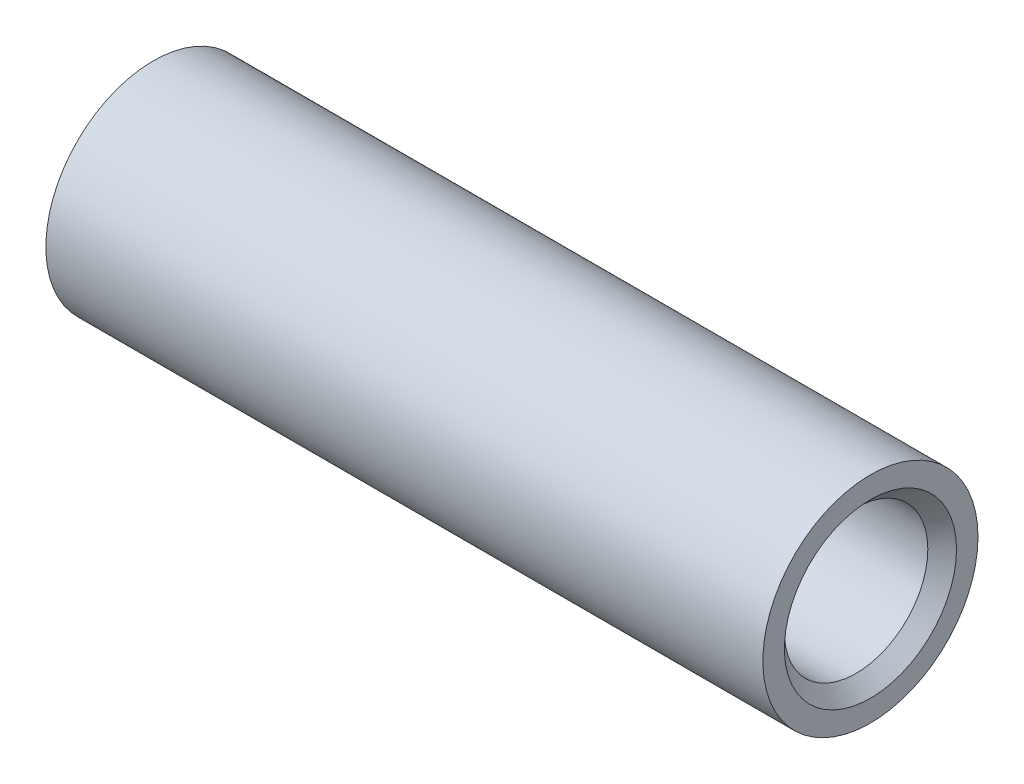
ISO-10303-21;
HEADER;
FILE_DESCRIPTION(('STEP AP214'),'2;1');
FILE_NAME('part.step','',(''),(''),'','','');
FILE_SCHEMA(('AUTOMOTIVE_DESIGN { 1 0 10303 214 1 1 1 1 }'));
ENDSEC;
DATA;
#1=APPLICATION_CONTEXT('core data for automotive mechanical design processes');
#2=APPLICATION_PROTOCOL_DEFINITION('international standard','automotive_design',2000,#1);
#3=PRODUCT_CONTEXT('',#1,'mechanical');
#4=PRODUCT('Part','Part','',(#3));
#5=PRODUCT_RELATED_PRODUCT_CATEGORY('part','',(#4));
#6=PRODUCT_DEFINITION_FORMATION('','',#4);
#7=PRODUCT_DEFINITION_CONTEXT('part definition',#1,'design');
#8=PRODUCT_DEFINITION('design','',#6,#7);
#9=PRODUCT_DEFINITION_SHAPE('','',#8);
#10=(LENGTH_UNIT() NAMED_UNIT(*) SI_UNIT(.MILLI.,.METRE.));
#11=(NAMED_UNIT(*) PLANE_ANGLE_UNIT() SI_UNIT($,.RADIAN.));
#12=(NAMED_UNIT(*) SI_UNIT($,.STERADIAN.) SOLID_ANGLE_UNIT());
#13=UNCERTAINTY_MEASURE_WITH_UNIT(LENGTH_MEASURE(1.E-05),#10,'distance_accuracy_value','');
#14=(GEOMETRIC_REPRESENTATION_CONTEXT(3) GLOBAL_UNCERTAINTY_ASSIGNED_CONTEXT((#13)) GLOBAL_UNIT_ASSIGNED_CONTEXT((#10,
#11,#12)) REPRESENTATION_CONTEXT('',''));
#15=CARTESIAN_POINT('',(0.,0.,0.));
#16=DIRECTION('',(0.,0.,1.));
#17=DIRECTION('',(1.,0.,0.));
#18=AXIS2_PLACEMENT_3D('',#15,#16,#17);
#19=CARTESIAN_POINT('',(482.,1070.,514.999999999998));
#20=DIRECTION('',(1.,0.,0.));
#21=DIRECTION('',(0.,0.,-1.));
#22=AXIS2_PLACEMENT_3D('',#19,#20,#21);
#23=CYLINDRICAL_SURFACE('',#22,15.0000000000001);
#24=CARTESIAN_POINT('',(482.,1070.,514.999999999998));
#25=DIRECTION('',(1.,0.,0.));
#26=DIRECTION('',(0.,0.,-1.));
#27=AXIS2_PLACEMENT_3D('',#24,#25,#26);
#28=CIRCLE('',#27,15.0000000000001);
#29=CARTESIAN_POINT('',(482.,1070.,499.999999999998));
#30=VERTEX_POINT('',#29);
#31=EDGE_CURVE('E47',#30,#30,#28,.T.);
#32=ORIENTED_EDGE('',*,*,#31,.T.);
#33=EDGE_LOOP('',(#32));
#34=FACE_BOUND('',#33,.T.);
#35=CARTESIAN_POINT('',(582.,1070.,514.999999999997));
#36=DIRECTION('',(1.,0.,0.));
#37=DIRECTION('',(0.,0.,-1.));
#38=AXIS2_PLACEMENT_3D('',#35,#36,#37);
#39=CIRCLE('',#38,15.0000000000001);
#40=CARTESIAN_POINT('',(582.,1070.,499.999999999997));
#41=VERTEX_POINT('',#40);
#42=EDGE_CURVE('E51',#41,#41,#39,.T.);
#43=ORIENTED_EDGE('',*,*,#42,.F.);
#44=EDGE_LOOP('',(#43));
#45=FACE_BOUND('',#44,.T.);
#46=ADVANCED_FACE('F35',(#34,#45),#23,.T.);
#47=CARTESIAN_POINT('',(482.,1070.,514.999999999998));
#48=DIRECTION('',(1.,0.,0.));
#49=DIRECTION('',(0.,0.,-1.));
#50=AXIS2_PLACEMENT_3D('',#47,#48,#49);
#51=PLANE('',#50);
#52=CARTESIAN_POINT('',(482.,1070.,514.999999999998));
#53=DIRECTION('',(1.,0.,0.));
#54=DIRECTION('',(0.,0.,-1.));
#55=AXIS2_PLACEMENT_3D('',#52,#53,#54);
#56=CIRCLE('',#55,10.0000000000001);
#57=CARTESIAN_POINT('',(482.,1070.,504.999999999998));
#58=VERTEX_POINT('',#57);
#59=EDGE_CURVE('E55',#58,#58,#56,.T.);
#60=ORIENTED_EDGE('',*,*,#59,.T.);
#61=EDGE_LOOP('',(#60));
#62=FACE_BOUND('',#61,.T.);
#63=ORIENTED_EDGE('',*,*,#31,.F.);
#64=EDGE_LOOP('',(#63));
#65=FACE_BOUND('',#64,.T.);
#66=ADVANCED_FACE('F60',(#62,#65),#51,.F.);
#67=CARTESIAN_POINT('',(582.,1070.,514.999999999997));
#68=DIRECTION('',(1.,0.,0.));
#69=DIRECTION('',(0.,0.,-1.));
#70=AXIS2_PLACEMENT_3D('',#67,#68,#69);
#71=PLANE('',#70);
#72=CARTESIAN_POINT('',(582.,1070.,514.999999999997));
#73=DIRECTION('',(1.,0.,0.));
#74=DIRECTION('',(0.,0.,-1.));
#75=AXIS2_PLACEMENT_3D('',#72,#73,#74);
#76=CIRCLE('',#75,12.0000000000005);
#77=CARTESIAN_POINT('',(582.,1070.,502.999999999997));
#78=VERTEX_POINT('',#77);
#79=EDGE_CURVE('E10',#78,#78,#76,.F.);
#80=ORIENTED_EDGE('',*,*,#79,.T.);
#81=EDGE_LOOP('',(#80));
#82=FACE_BOUND('',#81,.T.);
#83=ORIENTED_EDGE('',*,*,#42,.T.);
#84=EDGE_LOOP('',(#83));
#85=FACE_BOUND('',#84,.T.);
#86=ADVANCED_FACE('F65',(#82,#85),#71,.T.);
#87=CARTESIAN_POINT('',(482.,1070.,514.999999999998));
#88=DIRECTION('',(1.,0.,0.));
#89=DIRECTION('',(0.,0.,-1.));
#90=AXIS2_PLACEMENT_3D('',#87,#88,#89);
#91=CYLINDRICAL_SURFACE('',#90,10.0000000000001);
#92=CARTESIAN_POINT('',(580.,1070.,514.999999999997));
#93=DIRECTION('',(1.,0.,0.));
#94=DIRECTION('',(0.,0.,-1.));
#95=AXIS2_PLACEMENT_3D('',#92,#93,#94);
#96=CIRCLE('',#95,10.0000000000001);
#97=CARTESIAN_POINT('',(580.,1070.,504.999999999997));
#98=VERTEX_POINT('',#97);
#99=EDGE_CURVE('E43',#98,#98,#96,.T.);
#100=ORIENTED_EDGE('',*,*,#99,.T.);
#101=EDGE_LOOP('',(#100));
#102=FACE_BOUND('',#101,.T.);
#103=ORIENTED_EDGE('',*,*,#59,.F.);
#104=EDGE_LOOP('',(#103));
#105=FACE_BOUND('',#104,.T.);
#106=ADVANCED_FACE('F63',(#102,#105),#91,.F.);
#107=CARTESIAN_POINT('',(580.,1070.,514.999999999997));
#108=DIRECTION('',(1.,0.,0.));
#109=DIRECTION('',(0.,0.,-1.));
#110=AXIS2_PLACEMENT_3D('',#107,#108,#109);
#111=CONICAL_SURFACE('',#110,10.0000000000001,0.785398163397443);
#112=ORIENTED_EDGE('',*,*,#79,.F.);
#113=EDGE_LOOP('',(#112));
#114=FACE_BOUND('',#113,.T.);
#115=ORIENTED_EDGE('',*,*,#99,.F.);
#116=EDGE_LOOP('',(#115));
#117=FACE_BOUND('',#116,.T.);
#118=ADVANCED_FACE('F38',(#114,#117),#111,.F.);
#119=CLOSED_SHELL('',(#46,#66,#86,#106,#118));
#120=MANIFOLD_SOLID_BREP('B2',#119);
#121=ADVANCED_BREP_SHAPE_REPRESENTATION('',(#18,#120),#14);
#122=SHAPE_DEFINITION_REPRESENTATION(#9,#121);
ENDSEC;
END-ISO-10303-21;
